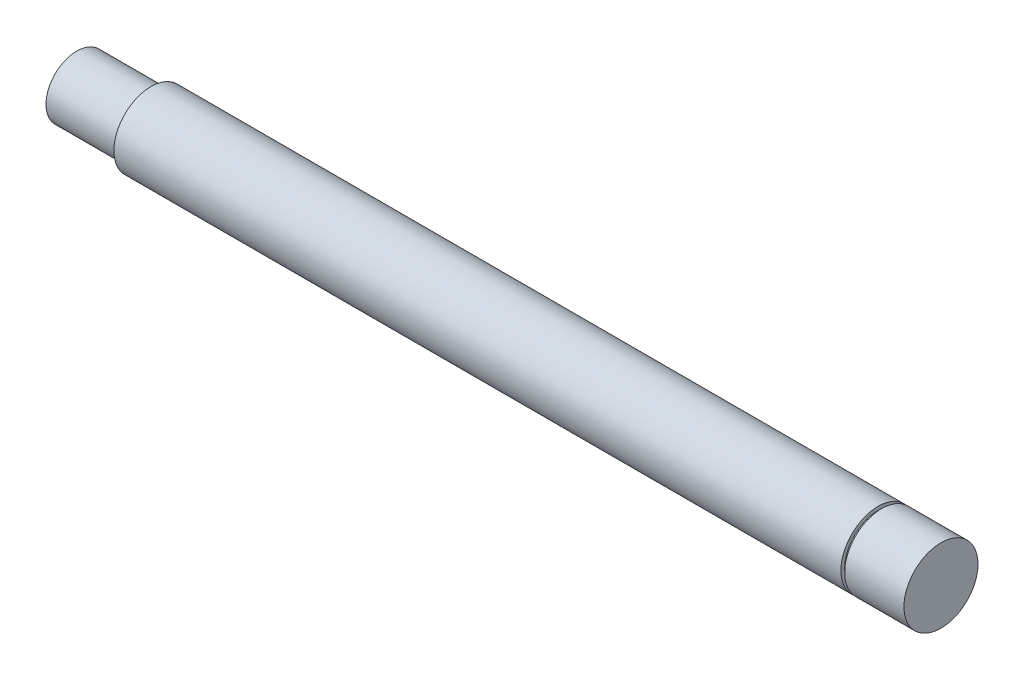
ISO-10303-21;
HEADER;
FILE_DESCRIPTION(('STEP AP214'),'2;1');
FILE_NAME('part.step','',(''),(''),'','','');
FILE_SCHEMA(('AUTOMOTIVE_DESIGN { 1 0 10303 214 1 1 1 1 }'));
ENDSEC;
DATA;
#1=APPLICATION_CONTEXT('core data for automotive mechanical design processes');
#2=APPLICATION_PROTOCOL_DEFINITION('international standard','automotive_design',2000,#1);
#3=PRODUCT_CONTEXT('',#1,'mechanical');
#4=PRODUCT('Part','Part','',(#3));
#5=PRODUCT_RELATED_PRODUCT_CATEGORY('part','',(#4));
#6=PRODUCT_DEFINITION_FORMATION('','',#4);
#7=PRODUCT_DEFINITION_CONTEXT('part definition',#1,'design');
#8=PRODUCT_DEFINITION('design','',#6,#7);
#9=PRODUCT_DEFINITION_SHAPE('','',#8);
#10=(LENGTH_UNIT() NAMED_UNIT(*) SI_UNIT(.MILLI.,.METRE.));
#11=(NAMED_UNIT(*) PLANE_ANGLE_UNIT() SI_UNIT($,.RADIAN.));
#12=(NAMED_UNIT(*) SI_UNIT($,.STERADIAN.) SOLID_ANGLE_UNIT());
#13=UNCERTAINTY_MEASURE_WITH_UNIT(LENGTH_MEASURE(1.E-05),#10,'distance_accuracy_value','');
#14=(GEOMETRIC_REPRESENTATION_CONTEXT(3) GLOBAL_UNCERTAINTY_ASSIGNED_CONTEXT((#13)) GLOBAL_UNIT_ASSIGNED_CONTEXT((#10,
#11,#12)) REPRESENTATION_CONTEXT('',''));
#15=CARTESIAN_POINT('',(0.,0.,0.));
#16=DIRECTION('',(0.,0.,1.));
#17=DIRECTION('',(1.,0.,0.));
#18=AXIS2_PLACEMENT_3D('',#15,#16,#17);
#19=CARTESIAN_POINT('',(175.,0.,0.));
#20=DIRECTION('',(-1.,0.,0.));
#21=DIRECTION('',(0.,0.,1.));
#22=AXIS2_PLACEMENT_3D('',#19,#20,#21);
#23=CYLINDRICAL_SURFACE('',#22,7.5);
#24=CARTESIAN_POINT('',(162.25,0.,0.));
#25=DIRECTION('',(1.,0.,0.));
#26=DIRECTION('',(0.,0.,-1.));
#27=AXIS2_PLACEMENT_3D('',#24,#25,#26);
#28=CIRCLE('',#27,7.5);
#29=CARTESIAN_POINT('',(162.25,0.,-7.5));
#30=VERTEX_POINT('',#29);
#31=EDGE_CURVE('E39',#30,#30,#28,.T.);
#32=ORIENTED_EDGE('',*,*,#31,.F.);
#33=EDGE_LOOP('',(#32));
#34=FACE_BOUND('',#33,.T.);
#35=CARTESIAN_POINT('',(15.,0.,0.));
#36=DIRECTION('',(-1.,0.,0.));
#37=DIRECTION('',(0.,0.,1.));
#38=AXIS2_PLACEMENT_3D('',#35,#36,#37);
#39=CIRCLE('',#38,7.5);
#40=CARTESIAN_POINT('',(15.,0.,7.5));
#41=VERTEX_POINT('',#40);
#42=EDGE_CURVE('E53',#41,#41,#39,.T.);
#43=ORIENTED_EDGE('',*,*,#42,.F.);
#44=EDGE_LOOP('',(#43));
#45=FACE_BOUND('',#44,.T.);
#46=ADVANCED_FACE('F32',(#34,#45),#23,.T.);
#47=CARTESIAN_POINT('',(162.25,0.,0.));
#48=DIRECTION('',(1.,0.,0.));
#49=DIRECTION('',(0.,0.,-1.));
#50=AXIS2_PLACEMENT_3D('',#47,#48,#49);
#51=PLANE('',#50);
#52=CARTESIAN_POINT('',(162.25,0.,0.));
#53=DIRECTION('',(1.,0.,0.));
#54=DIRECTION('',(0.,0.,-1.));
#55=AXIS2_PLACEMENT_3D('',#52,#53,#54);
#56=CIRCLE('',#55,6.75);
#57=CARTESIAN_POINT('',(162.25,0.,-6.75));
#58=VERTEX_POINT('',#57);
#59=EDGE_CURVE('E48',#58,#58,#56,.T.);
#60=ORIENTED_EDGE('',*,*,#59,.F.);
#61=EDGE_LOOP('',(#60));
#62=FACE_BOUND('',#61,.T.);
#63=ORIENTED_EDGE('',*,*,#31,.T.);
#64=EDGE_LOOP('',(#63));
#65=FACE_BOUND('',#64,.T.);
#66=ADVANCED_FACE('F75',(#62,#65),#51,.T.);
#67=CARTESIAN_POINT('',(163.,0.,0.));
#68=DIRECTION('',(1.,0.,0.));
#69=DIRECTION('',(0.,0.,-1.));
#70=AXIS2_PLACEMENT_3D('',#67,#68,#69);
#71=PLANE('',#70);
#72=CARTESIAN_POINT('',(163.,0.,0.));
#73=DIRECTION('',(1.,0.,0.));
#74=DIRECTION('',(0.,0.,-1.));
#75=AXIS2_PLACEMENT_3D('',#72,#73,#74);
#76=CIRCLE('',#75,6.75);
#77=CARTESIAN_POINT('',(163.,0.,-6.75));
#78=VERTEX_POINT('',#77);
#79=EDGE_CURVE('E50',#78,#78,#76,.T.);
#80=ORIENTED_EDGE('',*,*,#79,.T.);
#81=EDGE_LOOP('',(#80));
#82=FACE_BOUND('',#81,.T.);
#83=CARTESIAN_POINT('',(163.,0.,0.));
#84=DIRECTION('',(1.,0.,0.));
#85=DIRECTION('',(0.,0.,-1.));
#86=AXIS2_PLACEMENT_3D('',#83,#84,#85);
#87=CIRCLE('',#86,7.5);
#88=CARTESIAN_POINT('',(163.,0.,-7.5));
#89=VERTEX_POINT('',#88);
#90=EDGE_CURVE('E43',#89,#89,#87,.T.);
#91=ORIENTED_EDGE('',*,*,#90,.F.);
#92=EDGE_LOOP('',(#91));
#93=FACE_BOUND('',#92,.T.);
#94=ADVANCED_FACE('F80',(#82,#93),#71,.F.);
#95=CARTESIAN_POINT('',(162.25,0.,0.));
#96=DIRECTION('',(1.,0.,0.));
#97=DIRECTION('',(0.,0.,-1.));
#98=AXIS2_PLACEMENT_3D('',#95,#96,#97);
#99=CYLINDRICAL_SURFACE('',#98,6.75);
#100=ORIENTED_EDGE('',*,*,#59,.T.);
#101=EDGE_LOOP('',(#100));
#102=FACE_BOUND('',#101,.T.);
#103=ORIENTED_EDGE('',*,*,#79,.F.);
#104=EDGE_LOOP('',(#103));
#105=FACE_BOUND('',#104,.T.);
#106=ADVANCED_FACE('F89',(#102,#105),#99,.T.);
#107=CARTESIAN_POINT('',(175.,0.,0.));
#108=DIRECTION('',(1.,0.,0.));
#109=DIRECTION('',(0.,0.,-1.));
#110=AXIS2_PLACEMENT_3D('',#107,#108,#109);
#111=PLANE('',#110);
#112=CARTESIAN_POINT('',(175.,0.,0.));
#113=DIRECTION('',(1.,0.,0.));
#114=DIRECTION('',(0.,0.,-1.));
#115=AXIS2_PLACEMENT_3D('',#112,#113,#114);
#116=CIRCLE('',#115,7.5);
#117=CARTESIAN_POINT('',(175.,0.,-7.5));
#118=VERTEX_POINT('',#117);
#119=EDGE_CURVE('E10',#118,#118,#116,.T.);
#120=ORIENTED_EDGE('',*,*,#119,.T.);
#121=EDGE_LOOP('',(#120));
#122=FACE_BOUND('',#121,.T.);
#123=ADVANCED_FACE('F84',(#122),#111,.T.);
#124=ORIENTED_EDGE('',*,*,#90,.T.);
#125=EDGE_LOOP('',(#124));
#126=FACE_BOUND('',#125,.T.);
#127=ORIENTED_EDGE('',*,*,#119,.F.);
#128=EDGE_LOOP('',(#127));
#129=FACE_BOUND('',#128,.T.);
#130=ADVANCED_FACE('F34',(#126,#129),#23,.T.);
#131=CARTESIAN_POINT('',(15.,0.,0.));
#132=DIRECTION('',(-1.,0.,0.));
#133=DIRECTION('',(0.,0.,1.));
#134=AXIS2_PLACEMENT_3D('',#131,#132,#133);
#135=PLANE('',#134);
#136=CARTESIAN_POINT('',(15.,0.,0.));
#137=DIRECTION('',(-1.,0.,0.));
#138=DIRECTION('',(0.,0.,1.));
#139=AXIS2_PLACEMENT_3D('',#136,#137,#138);
#140=CIRCLE('',#139,6.25);
#141=CARTESIAN_POINT('',(15.,0.,6.25));
#142=VERTEX_POINT('',#141);
#143=EDGE_CURVE('E58',#142,#142,#140,.T.);
#144=ORIENTED_EDGE('',*,*,#143,.F.);
#145=EDGE_LOOP('',(#144));
#146=FACE_BOUND('',#145,.T.);
#147=ORIENTED_EDGE('',*,*,#42,.T.);
#148=EDGE_LOOP('',(#147));
#149=FACE_BOUND('',#148,.T.);
#150=ADVANCED_FACE('F68',(#146,#149),#135,.T.);
#151=CARTESIAN_POINT('',(15.,0.,0.));
#152=DIRECTION('',(-1.,0.,0.));
#153=DIRECTION('',(0.,0.,1.));
#154=AXIS2_PLACEMENT_3D('',#151,#152,#153);
#155=CYLINDRICAL_SURFACE('',#154,6.25);
#156=ORIENTED_EDGE('',*,*,#143,.T.);
#157=EDGE_LOOP('',(#156));
#158=FACE_BOUND('',#157,.T.);
#159=CARTESIAN_POINT('',(0.,0.,0.));
#160=DIRECTION('',(-1.,0.,0.));
#161=DIRECTION('',(0.,0.,1.));
#162=AXIS2_PLACEMENT_3D('',#159,#160,#161);
#163=CIRCLE('',#162,6.25);
#164=CARTESIAN_POINT('',(0.,0.,6.25));
#165=VERTEX_POINT('',#164);
#166=EDGE_CURVE('E59',#165,#165,#163,.T.);
#167=ORIENTED_EDGE('',*,*,#166,.F.);
#168=EDGE_LOOP('',(#167));
#169=FACE_BOUND('',#168,.T.);
#170=ADVANCED_FACE('F65',(#158,#169),#155,.T.);
#171=CARTESIAN_POINT('',(0.,0.,0.));
#172=DIRECTION('',(1.,0.,0.));
#173=DIRECTION('',(0.,0.,-1.));
#174=AXIS2_PLACEMENT_3D('',#171,#172,#173);
#175=PLANE('',#174);
#176=ORIENTED_EDGE('',*,*,#166,.T.);
#177=EDGE_LOOP('',(#176));
#178=FACE_BOUND('',#177,.T.);
#179=ADVANCED_FACE('F102',(#178),#175,.F.);
#180=CLOSED_SHELL('',(#46,#66,#94,#106,#123,#130,#150,#170,#179));
#181=MANIFOLD_SOLID_BREP('B2',#180);
#182=ADVANCED_BREP_SHAPE_REPRESENTATION('',(#18,#181),#14);
#183=SHAPE_DEFINITION_REPRESENTATION(#9,#182);
ENDSEC;
END-ISO-10303-21;
